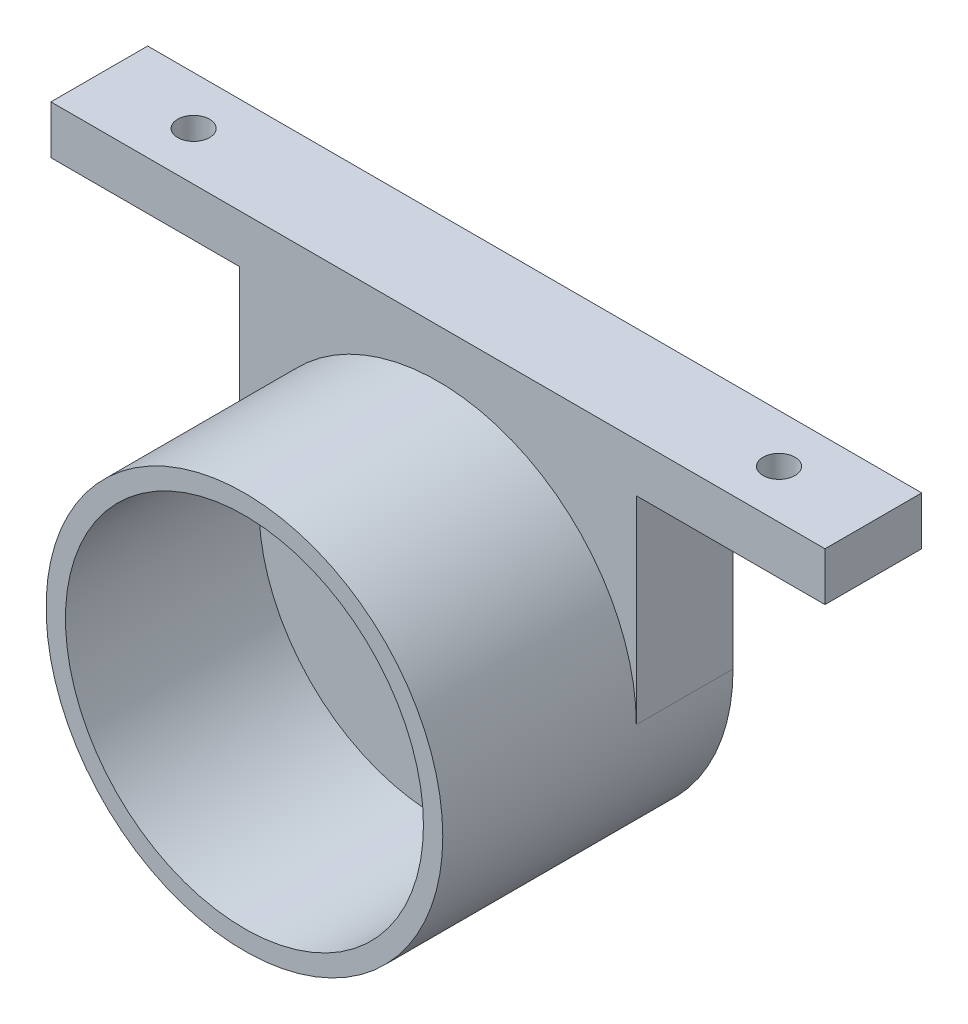
ISO-10303-21;
HEADER;
FILE_DESCRIPTION(('STEP AP214'),'2;1');
FILE_NAME('part.step','',(''),(''),'','','');
FILE_SCHEMA(('AUTOMOTIVE_DESIGN { 1 0 10303 214 1 1 1 1 }'));
ENDSEC;
DATA;
#1=APPLICATION_CONTEXT('core data for automotive mechanical design processes');
#2=APPLICATION_PROTOCOL_DEFINITION('international standard','automotive_design',2000,#1);
#3=PRODUCT_CONTEXT('',#1,'mechanical');
#4=PRODUCT('Part','Part','',(#3));
#5=PRODUCT_RELATED_PRODUCT_CATEGORY('part','',(#4));
#6=PRODUCT_DEFINITION_FORMATION('','',#4);
#7=PRODUCT_DEFINITION_CONTEXT('part definition',#1,'design');
#8=PRODUCT_DEFINITION('design','',#6,#7);
#9=PRODUCT_DEFINITION_SHAPE('','',#8);
#10=(LENGTH_UNIT() NAMED_UNIT(*) SI_UNIT(.MILLI.,.METRE.));
#11=(NAMED_UNIT(*) PLANE_ANGLE_UNIT() SI_UNIT($,.RADIAN.));
#12=(NAMED_UNIT(*) SI_UNIT($,.STERADIAN.) SOLID_ANGLE_UNIT());
#13=UNCERTAINTY_MEASURE_WITH_UNIT(LENGTH_MEASURE(1.E-05),#10,'distance_accuracy_value','');
#14=(GEOMETRIC_REPRESENTATION_CONTEXT(3) GLOBAL_UNCERTAINTY_ASSIGNED_CONTEXT((#13)) GLOBAL_UNIT_ASSIGNED_CONTEXT((#10,
#11,#12)) REPRESENTATION_CONTEXT('',''));
#15=CARTESIAN_POINT('',(0.,0.,0.));
#16=DIRECTION('',(0.,0.,1.));
#17=DIRECTION('',(1.,0.,0.));
#18=AXIS2_PLACEMENT_3D('',#15,#16,#17);
#19=CARTESIAN_POINT('',(0.,20.5,0.));
#20=DIRECTION('',(0.,-1.,0.));
#21=DIRECTION('',(0.,0.,-1.));
#22=AXIS2_PLACEMENT_3D('',#19,#20,#21);
#23=PLANE('',#22);
#24=CARTESIAN_POINT('',(-30.25,20.5,-4.99999999999999));
#25=DIRECTION('',(0.,-1.,0.));
#26=DIRECTION('',(0.,0.,-1.));
#27=AXIS2_PLACEMENT_3D('',#24,#25,#26);
#28=CIRCLE('',#27,2.025);
#29=CARTESIAN_POINT('',(-30.25,20.5,-7.02499999999999));
#30=VERTEX_POINT('',#29);
#31=EDGE_CURVE('E487',#30,#30,#28,.T.);
#32=ORIENTED_EDGE('',*,*,#31,.F.);
#33=EDGE_LOOP('',(#32));
#34=FACE_BOUND('',#33,.T.);
#35=DIRECTION('',(-1.,0.,0.));
#36=VECTOR('',#35,1.);
#37=CARTESIAN_POINT('',(10.,20.5,-10.));
#38=LINE('',#37,#36);
#39=CARTESIAN_POINT('',(-20.5,20.5,-10.));
#40=VERTEX_POINT('',#39);
#41=CARTESIAN_POINT('',(-40.,20.5,-9.99999999999999));
#42=VERTEX_POINT('',#41);
#43=EDGE_CURVE('E184',#40,#42,#38,.T.);
#44=ORIENTED_EDGE('',*,*,#43,.F.);
#45=DIRECTION('',(0.,0.,-1.));
#46=VECTOR('',#45,1.);
#47=CARTESIAN_POINT('',(-20.5,20.5,0.));
#48=LINE('',#47,#46);
#49=CARTESIAN_POINT('',(-20.5,20.5,0.));
#50=VERTEX_POINT('',#49);
#51=EDGE_CURVE('E153',#50,#40,#48,.T.);
#52=ORIENTED_EDGE('',*,*,#51,.F.);
#53=DIRECTION('',(1.,0.,0.));
#54=VECTOR('',#53,1.);
#55=CARTESIAN_POINT('',(0.,20.5,0.));
#56=LINE('',#55,#54);
#57=CARTESIAN_POINT('',(-40.,20.5,0.));
#58=VERTEX_POINT('',#57);
#59=EDGE_CURVE('E149',#58,#50,#56,.T.);
#60=ORIENTED_EDGE('',*,*,#59,.F.);
#61=DIRECTION('',(0.,0.,1.));
#62=VECTOR('',#61,1.);
#63=CARTESIAN_POINT('',(-40.,20.5,0.));
#64=LINE('',#63,#62);
#65=EDGE_CURVE('E169',#42,#58,#64,.T.);
#66=ORIENTED_EDGE('',*,*,#65,.F.);
#67=EDGE_LOOP('',(#44,#52,#60,#66));
#68=FACE_BOUND('',#67,.T.);
#69=ADVANCED_FACE('F67',(#34,#68),#23,.T.);
#70=CARTESIAN_POINT('',(0.,0.,20.));
#71=DIRECTION('',(0.,0.,-1.));
#72=DIRECTION('',(-1.,0.,0.));
#73=AXIS2_PLACEMENT_3D('',#70,#71,#72);
#74=CYLINDRICAL_SURFACE('',#73,20.5);
#75=CARTESIAN_POINT('',(0.,0.,20.));
#76=DIRECTION('',(0.,0.,1.));
#77=DIRECTION('',(1.,0.,0.));
#78=AXIS2_PLACEMENT_3D('',#75,#76,#77);
#79=CIRCLE('',#78,20.5);
#80=CARTESIAN_POINT('',(20.5,0.,20.));
#81=VERTEX_POINT('',#80);
#82=EDGE_CURVE('E12',#81,#81,#79,.T.);
#83=ORIENTED_EDGE('',*,*,#82,.F.);
#84=EDGE_LOOP('',(#83));
#85=FACE_BOUND('',#84,.T.);
#86=CARTESIAN_POINT('',(0.,0.,0.));
#87=DIRECTION('',(0.,0.,1.));
#88=DIRECTION('',(1.,0.,0.));
#89=AXIS2_PLACEMENT_3D('',#86,#87,#88);
#90=CIRCLE('',#89,20.5);
#91=CARTESIAN_POINT('',(20.5,0.,0.));
#92=VERTEX_POINT('',#91);
#93=CARTESIAN_POINT('',(-20.5,0.,0.));
#94=VERTEX_POINT('',#93);
#95=EDGE_CURVE('E133',#92,#94,#90,.T.);
#96=ORIENTED_EDGE('',*,*,#95,.T.);
#97=DIRECTION('',(0.,0.,-1.));
#98=VECTOR('',#97,1.);
#99=CARTESIAN_POINT('',(-20.5,0.,0.));
#100=LINE('',#99,#98);
#101=CARTESIAN_POINT('',(-20.5,0.,-10.));
#102=VERTEX_POINT('',#101);
#103=EDGE_CURVE('E137',#94,#102,#100,.T.);
#104=ORIENTED_EDGE('',*,*,#103,.T.);
#105=CARTESIAN_POINT('',(0.,0.,-10.));
#106=DIRECTION('',(0.,0.,-1.));
#107=DIRECTION('',(-1.,0.,0.));
#108=AXIS2_PLACEMENT_3D('',#105,#106,#107);
#109=CIRCLE('',#108,20.5);
#110=CARTESIAN_POINT('',(20.5,0.,-10.));
#111=VERTEX_POINT('',#110);
#112=EDGE_CURVE('E214',#111,#102,#109,.T.);
#113=ORIENTED_EDGE('',*,*,#112,.F.);
#114=DIRECTION('',(0.,0.,-1.));
#115=VECTOR('',#114,1.);
#116=CARTESIAN_POINT('',(20.5,0.,0.));
#117=LINE('',#116,#115);
#118=EDGE_CURVE('E138',#92,#111,#117,.T.);
#119=ORIENTED_EDGE('',*,*,#118,.F.);
#120=EDGE_LOOP('',(#96,#104,#113,#119));
#121=FACE_BOUND('',#120,.T.);
#122=ADVANCED_FACE('F69',(#85,#121),#74,.T.);
#123=CARTESIAN_POINT('',(0.,0.,20.));
#124=DIRECTION('',(0.,0.,1.));
#125=DIRECTION('',(1.,0.,0.));
#126=AXIS2_PLACEMENT_3D('',#123,#124,#125);
#127=PLANE('',#126);
#128=ORIENTED_EDGE('',*,*,#82,.T.);
#129=EDGE_LOOP('',(#128));
#130=FACE_BOUND('',#129,.T.);
#131=CARTESIAN_POINT('',(0.,0.,20.));
#132=DIRECTION('',(0.,0.,1.));
#133=DIRECTION('',(1.,0.,0.));
#134=AXIS2_PLACEMENT_3D('',#131,#132,#133);
#135=CIRCLE('',#134,18.5);
#136=CARTESIAN_POINT('',(18.5,0.,20.));
#137=VERTEX_POINT('',#136);
#138=EDGE_CURVE('E76',#137,#137,#135,.T.);
#139=ORIENTED_EDGE('',*,*,#138,.F.);
#140=EDGE_LOOP('',(#139));
#141=FACE_BOUND('',#140,.T.);
#142=ADVANCED_FACE('F228',(#130,#141),#127,.T.);
#143=CARTESIAN_POINT('',(0.,0.,20.));
#144=DIRECTION('',(0.,0.,-1.));
#145=DIRECTION('',(-1.,0.,0.));
#146=AXIS2_PLACEMENT_3D('',#143,#144,#145);
#147=CYLINDRICAL_SURFACE('',#146,18.5);
#148=ORIENTED_EDGE('',*,*,#138,.T.);
#149=EDGE_LOOP('',(#148));
#150=FACE_BOUND('',#149,.T.);
#151=CARTESIAN_POINT('',(0.,0.,0.));
#152=DIRECTION('',(0.,0.,1.));
#153=DIRECTION('',(1.,0.,0.));
#154=AXIS2_PLACEMENT_3D('',#151,#152,#153);
#155=CIRCLE('',#154,18.5);
#156=CARTESIAN_POINT('',(18.5,0.,0.));
#157=VERTEX_POINT('',#156);
#158=EDGE_CURVE('E217',#157,#157,#155,.T.);
#159=ORIENTED_EDGE('',*,*,#158,.F.);
#160=EDGE_LOOP('',(#159));
#161=FACE_BOUND('',#160,.T.);
#162=ADVANCED_FACE('F226',(#150,#161),#147,.F.);
#163=CARTESIAN_POINT('',(0.,0.,0.));
#164=DIRECTION('',(0.,0.,-1.));
#165=DIRECTION('',(-1.,0.,0.));
#166=AXIS2_PLACEMENT_3D('',#163,#164,#165);
#167=PLANE('',#166);
#168=ORIENTED_EDGE('',*,*,#158,.T.);
#169=EDGE_LOOP('',(#168));
#170=FACE_BOUND('',#169,.T.);
#171=ADVANCED_FACE('F224',(#170),#167,.F.);
#172=CARTESIAN_POINT('',(0.,0.,-10.));
#173=DIRECTION('',(0.,0.,-1.));
#174=DIRECTION('',(-1.,0.,0.));
#175=AXIS2_PLACEMENT_3D('',#172,#173,#174);
#176=PLANE('',#175);
#177=ORIENTED_EDGE('',*,*,#112,.T.);
#178=DIRECTION('',(0.,-1.,0.));
#179=VECTOR('',#178,1.);
#180=CARTESIAN_POINT('',(-20.5,0.,-10.));
#181=LINE('',#180,#179);
#182=EDGE_CURVE('E83',#40,#102,#181,.T.);
#183=ORIENTED_EDGE('',*,*,#182,.F.);
#184=ORIENTED_EDGE('',*,*,#43,.T.);
#185=DIRECTION('',(0.,-1.,0.));
#186=VECTOR('',#185,1.);
#187=CARTESIAN_POINT('',(-40.,25.5,-9.99999999999999));
#188=LINE('',#187,#186);
#189=CARTESIAN_POINT('',(-40.,25.5,-9.99999999999999));
#190=VERTEX_POINT('',#189);
#191=EDGE_CURVE('E193',#190,#42,#188,.T.);
#192=ORIENTED_EDGE('',*,*,#191,.F.);
#193=DIRECTION('',(-1.,0.,0.));
#194=VECTOR('',#193,1.);
#195=CARTESIAN_POINT('',(10.,25.5,-10.));
#196=LINE('',#195,#194);
#197=CARTESIAN_POINT('',(40.,25.5,-10.));
#198=VERTEX_POINT('',#197);
#199=EDGE_CURVE('E172',#198,#190,#196,.T.);
#200=ORIENTED_EDGE('',*,*,#199,.F.);
#201=DIRECTION('',(0.,-1.,0.));
#202=VECTOR('',#201,1.);
#203=CARTESIAN_POINT('',(40.,25.5,-10.));
#204=LINE('',#203,#202);
#205=CARTESIAN_POINT('',(40.,20.5,-10.));
#206=VERTEX_POINT('',#205);
#207=EDGE_CURVE('E197',#198,#206,#204,.T.);
#208=ORIENTED_EDGE('',*,*,#207,.T.);
#209=CARTESIAN_POINT('',(20.5,20.5,-10.));
#210=VERTEX_POINT('',#209);
#211=EDGE_CURVE('E185',#206,#210,#38,.T.);
#212=ORIENTED_EDGE('',*,*,#211,.T.);
#213=DIRECTION('',(0.,-1.,0.));
#214=VECTOR('',#213,1.);
#215=CARTESIAN_POINT('',(20.5,0.,-10.));
#216=LINE('',#215,#214);
#217=EDGE_CURVE('E89',#210,#111,#216,.T.);
#218=ORIENTED_EDGE('',*,*,#217,.T.);
#219=EDGE_LOOP('',(#177,#183,#184,#192,#200,#208,#212,#218));
#220=FACE_BOUND('',#219,.T.);
#221=ADVANCED_FACE('F235',(#220),#176,.T.);
#222=CARTESIAN_POINT('',(20.5,0.,0.));
#223=DIRECTION('',(1.,0.,0.));
#224=DIRECTION('',(0.,0.,-1.));
#225=AXIS2_PLACEMENT_3D('',#222,#223,#224);
#226=PLANE('',#225);
#227=ORIENTED_EDGE('',*,*,#217,.F.);
#228=DIRECTION('',(0.,0.,-1.));
#229=VECTOR('',#228,1.);
#230=CARTESIAN_POINT('',(20.5,20.5,0.));
#231=LINE('',#230,#229);
#232=CARTESIAN_POINT('',(20.5,20.5,0.));
#233=VERTEX_POINT('',#232);
#234=EDGE_CURVE('E207',#233,#210,#231,.T.);
#235=ORIENTED_EDGE('',*,*,#234,.F.);
#236=DIRECTION('',(0.,-1.,0.));
#237=VECTOR('',#236,1.);
#238=CARTESIAN_POINT('',(20.5,0.,0.));
#239=LINE('',#238,#237);
#240=EDGE_CURVE('E143',#233,#92,#239,.T.);
#241=ORIENTED_EDGE('',*,*,#240,.T.);
#242=ORIENTED_EDGE('',*,*,#118,.T.);
#243=EDGE_LOOP('',(#227,#235,#241,#242));
#244=FACE_BOUND('',#243,.T.);
#245=ADVANCED_FACE('F269',(#244),#226,.T.);
#246=CARTESIAN_POINT('',(0.,0.,0.));
#247=DIRECTION('',(0.,0.,1.));
#248=DIRECTION('',(1.,0.,0.));
#249=AXIS2_PLACEMENT_3D('',#246,#247,#248);
#250=PLANE('',#249);
#251=ORIENTED_EDGE('',*,*,#95,.F.);
#252=ORIENTED_EDGE('',*,*,#240,.F.);
#253=CARTESIAN_POINT('',(40.,20.5,0.));
#254=VERTEX_POINT('',#253);
#255=EDGE_CURVE('E157',#233,#254,#56,.T.);
#256=ORIENTED_EDGE('',*,*,#255,.T.);
#257=DIRECTION('',(0.,-1.,0.));
#258=VECTOR('',#257,1.);
#259=CARTESIAN_POINT('',(40.,25.5,0.));
#260=LINE('',#259,#258);
#261=CARTESIAN_POINT('',(40.,25.5,0.));
#262=VERTEX_POINT('',#261);
#263=EDGE_CURVE('E201',#262,#254,#260,.T.);
#264=ORIENTED_EDGE('',*,*,#263,.F.);
#265=DIRECTION('',(1.,0.,0.));
#266=VECTOR('',#265,1.);
#267=CARTESIAN_POINT('',(0.,25.5,0.));
#268=LINE('',#267,#266);
#269=CARTESIAN_POINT('',(-40.,25.5,0.));
#270=VERTEX_POINT('',#269);
#271=EDGE_CURVE('E165',#270,#262,#268,.T.);
#272=ORIENTED_EDGE('',*,*,#271,.F.);
#273=DIRECTION('',(0.,-1.,0.));
#274=VECTOR('',#273,1.);
#275=CARTESIAN_POINT('',(-40.,25.5,0.));
#276=LINE('',#275,#274);
#277=EDGE_CURVE('E177',#270,#58,#276,.T.);
#278=ORIENTED_EDGE('',*,*,#277,.T.);
#279=ORIENTED_EDGE('',*,*,#59,.T.);
#280=DIRECTION('',(0.,-1.,0.));
#281=VECTOR('',#280,1.);
#282=CARTESIAN_POINT('',(-20.5,0.,0.));
#283=LINE('',#282,#281);
#284=EDGE_CURVE('E146',#50,#94,#283,.T.);
#285=ORIENTED_EDGE('',*,*,#284,.T.);
#286=EDGE_LOOP('',(#251,#252,#256,#264,#272,#278,#279,#285));
#287=FACE_BOUND('',#286,.T.);
#288=ADVANCED_FACE('F147',(#287),#250,.T.);
#289=CARTESIAN_POINT('',(40.,25.5,0.));
#290=DIRECTION('',(-1.,0.,0.));
#291=DIRECTION('',(0.,0.,1.));
#292=AXIS2_PLACEMENT_3D('',#289,#290,#291);
#293=PLANE('',#292);
#294=DIRECTION('',(0.,0.,-1.));
#295=VECTOR('',#294,1.);
#296=CARTESIAN_POINT('',(40.,20.5,0.));
#297=LINE('',#296,#295);
#298=EDGE_CURVE('E180',#254,#206,#297,.T.);
#299=ORIENTED_EDGE('',*,*,#298,.T.);
#300=ORIENTED_EDGE('',*,*,#207,.F.);
#301=DIRECTION('',(0.,0.,-1.));
#302=VECTOR('',#301,1.);
#303=CARTESIAN_POINT('',(40.,25.5,0.));
#304=LINE('',#303,#302);
#305=EDGE_CURVE('E168',#262,#198,#304,.T.);
#306=ORIENTED_EDGE('',*,*,#305,.F.);
#307=ORIENTED_EDGE('',*,*,#263,.T.);
#308=EDGE_LOOP('',(#299,#300,#306,#307));
#309=FACE_BOUND('',#308,.T.);
#310=ADVANCED_FACE('F279',(#309),#293,.F.);
#311=CARTESIAN_POINT('',(-40.,25.5,0.));
#312=DIRECTION('',(1.,0.,0.));
#313=DIRECTION('',(0.,0.,-1.));
#314=AXIS2_PLACEMENT_3D('',#311,#312,#313);
#315=PLANE('',#314);
#316=ORIENTED_EDGE('',*,*,#65,.T.);
#317=ORIENTED_EDGE('',*,*,#277,.F.);
#318=DIRECTION('',(0.,0.,1.));
#319=VECTOR('',#318,1.);
#320=CARTESIAN_POINT('',(-40.,25.5,0.));
#321=LINE('',#320,#319);
#322=EDGE_CURVE('E175',#190,#270,#321,.T.);
#323=ORIENTED_EDGE('',*,*,#322,.F.);
#324=ORIENTED_EDGE('',*,*,#191,.T.);
#325=EDGE_LOOP('',(#316,#317,#323,#324));
#326=FACE_BOUND('',#325,.T.);
#327=ADVANCED_FACE('F259',(#326),#315,.F.);
#328=CARTESIAN_POINT('',(0.,25.5,0.));
#329=DIRECTION('',(0.,-1.,0.));
#330=DIRECTION('',(0.,0.,-1.));
#331=AXIS2_PLACEMENT_3D('',#328,#329,#330);
#332=PLANE('',#331);
#333=CARTESIAN_POINT('',(30.25,25.5,-5.));
#334=DIRECTION('',(0.,-1.,0.));
#335=DIRECTION('',(0.,0.,-1.));
#336=AXIS2_PLACEMENT_3D('',#333,#334,#335);
#337=CIRCLE('',#336,1.65);
#338=CARTESIAN_POINT('',(30.25,25.5,-6.65));
#339=VERTEX_POINT('',#338);
#340=EDGE_CURVE('E481',#339,#339,#337,.T.);
#341=ORIENTED_EDGE('',*,*,#340,.T.);
#342=EDGE_LOOP('',(#341));
#343=FACE_BOUND('',#342,.T.);
#344=CARTESIAN_POINT('',(-30.25,25.5,-4.99999999999999));
#345=DIRECTION('',(0.,-1.,0.));
#346=DIRECTION('',(0.,0.,-1.));
#347=AXIS2_PLACEMENT_3D('',#344,#345,#346);
#348=CIRCLE('',#347,1.65);
#349=CARTESIAN_POINT('',(-30.25,25.5,-6.64999999999999));
#350=VERTEX_POINT('',#349);
#351=EDGE_CURVE('E495',#350,#350,#348,.T.);
#352=ORIENTED_EDGE('',*,*,#351,.T.);
#353=EDGE_LOOP('',(#352));
#354=FACE_BOUND('',#353,.T.);
#355=ORIENTED_EDGE('',*,*,#271,.T.);
#356=ORIENTED_EDGE('',*,*,#305,.T.);
#357=ORIENTED_EDGE('',*,*,#199,.T.);
#358=ORIENTED_EDGE('',*,*,#322,.T.);
#359=EDGE_LOOP('',(#355,#356,#357,#358));
#360=FACE_BOUND('',#359,.T.);
#361=ADVANCED_FACE('F251',(#343,#354,#360),#332,.F.);
#362=CARTESIAN_POINT('',(30.25,20.5,-5.));
#363=DIRECTION('',(0.,-1.,0.));
#364=DIRECTION('',(0.,0.,-1.));
#365=AXIS2_PLACEMENT_3D('',#362,#363,#364);
#366=CIRCLE('',#365,2.025);
#367=CARTESIAN_POINT('',(30.25,20.5,-7.025));
#368=VERTEX_POINT('',#367);
#369=EDGE_CURVE('E264',#368,#368,#366,.T.);
#370=ORIENTED_EDGE('',*,*,#369,.F.);
#371=EDGE_LOOP('',(#370));
#372=FACE_BOUND('',#371,.T.);
#373=ORIENTED_EDGE('',*,*,#255,.F.);
#374=ORIENTED_EDGE('',*,*,#234,.T.);
#375=ORIENTED_EDGE('',*,*,#211,.F.);
#376=ORIENTED_EDGE('',*,*,#298,.F.);
#377=EDGE_LOOP('',(#373,#374,#375,#376));
#378=FACE_BOUND('',#377,.T.);
#379=ADVANCED_FACE('F241',(#372,#378),#23,.T.);
#380=CARTESIAN_POINT('',(-20.5,0.,0.));
#381=DIRECTION('',(1.,0.,0.));
#382=DIRECTION('',(0.,0.,-1.));
#383=AXIS2_PLACEMENT_3D('',#380,#381,#382);
#384=PLANE('',#383);
#385=ORIENTED_EDGE('',*,*,#182,.T.);
#386=ORIENTED_EDGE('',*,*,#103,.F.);
#387=ORIENTED_EDGE('',*,*,#284,.F.);
#388=ORIENTED_EDGE('',*,*,#51,.T.);
#389=EDGE_LOOP('',(#385,#386,#387,#388));
#390=FACE_BOUND('',#389,.T.);
#391=ADVANCED_FACE('F155',(#390),#384,.F.);
#392=CARTESIAN_POINT('',(-30.25,20.5,-4.99999999999999));
#393=DIRECTION('',(0.,-1.,0.));
#394=DIRECTION('',(0.,0.,-1.));
#395=AXIS2_PLACEMENT_3D('',#392,#393,#394);
#396=CYLINDRICAL_SURFACE('',#395,1.65);
#397=ORIENTED_EDGE('',*,*,#351,.F.);
#398=EDGE_LOOP('',(#397));
#399=FACE_BOUND('',#398,.T.);
#400=CARTESIAN_POINT('',(-30.25,20.875,-4.99999999999999));
#401=DIRECTION('',(0.,-1.,0.));
#402=DIRECTION('',(0.,0.,-1.));
#403=AXIS2_PLACEMENT_3D('',#400,#401,#402);
#404=CIRCLE('',#403,1.65);
#405=CARTESIAN_POINT('',(-30.25,20.875,-6.64999999999999));
#406=VERTEX_POINT('',#405);
#407=EDGE_CURVE('E491',#406,#406,#404,.T.);
#408=ORIENTED_EDGE('',*,*,#407,.T.);
#409=EDGE_LOOP('',(#408));
#410=FACE_BOUND('',#409,.T.);
#411=ADVANCED_FACE('F257',(#399,#410),#396,.F.);
#412=CARTESIAN_POINT('',(-30.25,20.5,-4.99999999999999));
#413=DIRECTION('',(0.,-1.,0.));
#414=DIRECTION('',(0.,0.,-1.));
#415=AXIS2_PLACEMENT_3D('',#412,#413,#414);
#416=CONICAL_SURFACE('',#415,2.025,0.785398163397444);
#417=ORIENTED_EDGE('',*,*,#407,.F.);
#418=EDGE_LOOP('',(#417));
#419=FACE_BOUND('',#418,.T.);
#420=ORIENTED_EDGE('',*,*,#31,.T.);
#421=EDGE_LOOP('',(#420));
#422=FACE_BOUND('',#421,.T.);
#423=ADVANCED_FACE('F321',(#419,#422),#416,.F.);
#424=CARTESIAN_POINT('',(30.25,20.5,-5.));
#425=DIRECTION('',(0.,-1.,0.));
#426=DIRECTION('',(0.,0.,-1.));
#427=AXIS2_PLACEMENT_3D('',#424,#425,#426);
#428=CYLINDRICAL_SURFACE('',#427,1.65);
#429=ORIENTED_EDGE('',*,*,#340,.F.);
#430=EDGE_LOOP('',(#429));
#431=FACE_BOUND('',#430,.T.);
#432=CARTESIAN_POINT('',(30.25,20.875,-5.));
#433=DIRECTION('',(0.,-1.,0.));
#434=DIRECTION('',(0.,0.,-1.));
#435=AXIS2_PLACEMENT_3D('',#432,#433,#434);
#436=CIRCLE('',#435,1.65);
#437=CARTESIAN_POINT('',(30.25,20.875,-6.65));
#438=VERTEX_POINT('',#437);
#439=EDGE_CURVE('E477',#438,#438,#436,.T.);
#440=ORIENTED_EDGE('',*,*,#439,.T.);
#441=EDGE_LOOP('',(#440));
#442=FACE_BOUND('',#441,.T.);
#443=ADVANCED_FACE('F336',(#431,#442),#428,.F.);
#444=CARTESIAN_POINT('',(30.25,20.5,-5.));
#445=DIRECTION('',(0.,-1.,0.));
#446=DIRECTION('',(0.,0.,-1.));
#447=AXIS2_PLACEMENT_3D('',#444,#445,#446);
#448=CONICAL_SURFACE('',#447,2.025,0.785398163397444);
#449=ORIENTED_EDGE('',*,*,#439,.F.);
#450=EDGE_LOOP('',(#449));
#451=FACE_BOUND('',#450,.T.);
#452=ORIENTED_EDGE('',*,*,#369,.T.);
#453=EDGE_LOOP('',(#452));
#454=FACE_BOUND('',#453,.T.);
#455=ADVANCED_FACE('F348',(#451,#454),#448,.F.);
#456=CLOSED_SHELL('',(#69,#122,#142,#162,#171,#221,#245,#288,#310,#327,#361,#379,#391,#411,#423,
#443,#455));
#457=MANIFOLD_SOLID_BREP('B2',#456);
#458=ADVANCED_BREP_SHAPE_REPRESENTATION('',(#18,#457),#14);
#459=SHAPE_DEFINITION_REPRESENTATION(#9,#458);
ENDSEC;
END-ISO-10303-21;
